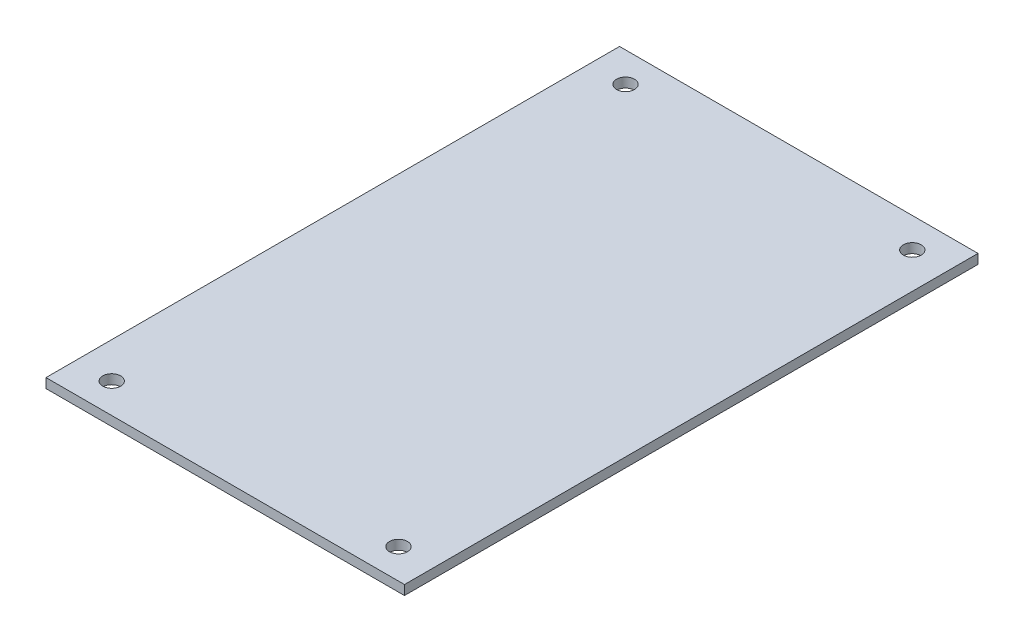
ISO-10303-21;
HEADER;
FILE_DESCRIPTION(('STEP AP214'),'2;1');
FILE_NAME('part.step','',(''),(''),'','','');
FILE_SCHEMA(('AUTOMOTIVE_DESIGN { 1 0 10303 214 1 1 1 1 }'));
ENDSEC;
DATA;
#1=APPLICATION_CONTEXT('core data for automotive mechanical design processes');
#2=APPLICATION_PROTOCOL_DEFINITION('international standard','automotive_design',2000,#1);
#3=PRODUCT_CONTEXT('',#1,'mechanical');
#4=PRODUCT('Part','Part','',(#3));
#5=PRODUCT_RELATED_PRODUCT_CATEGORY('part','',(#4));
#6=PRODUCT_DEFINITION_FORMATION('','',#4);
#7=PRODUCT_DEFINITION_CONTEXT('part definition',#1,'design');
#8=PRODUCT_DEFINITION('design','',#6,#7);
#9=PRODUCT_DEFINITION_SHAPE('','',#8);
#10=(LENGTH_UNIT() NAMED_UNIT(*) SI_UNIT(.MILLI.,.METRE.));
#11=(NAMED_UNIT(*) PLANE_ANGLE_UNIT() SI_UNIT($,.RADIAN.));
#12=(NAMED_UNIT(*) SI_UNIT($,.STERADIAN.) SOLID_ANGLE_UNIT());
#13=UNCERTAINTY_MEASURE_WITH_UNIT(LENGTH_MEASURE(1.E-05),#10,'distance_accuracy_value','');
#14=(GEOMETRIC_REPRESENTATION_CONTEXT(3) GLOBAL_UNCERTAINTY_ASSIGNED_CONTEXT((#13)) GLOBAL_UNIT_ASSIGNED_CONTEXT((#10,
#11,#12)) REPRESENTATION_CONTEXT('',''));
#15=CARTESIAN_POINT('',(0.,0.,0.));
#16=DIRECTION('',(0.,0.,1.));
#17=DIRECTION('',(1.,0.,0.));
#18=AXIS2_PLACEMENT_3D('',#15,#16,#17);
#19=CARTESIAN_POINT('',(-30.,0.,48.));
#20=DIRECTION('',(0.,1.,0.));
#21=DIRECTION('',(0.,0.,1.));
#22=AXIS2_PLACEMENT_3D('',#19,#20,#21);
#23=PLANE('',#22);
#24=DIRECTION('',(0.,0.,-1.));
#25=VECTOR('',#24,1.);
#26=CARTESIAN_POINT('',(30.,0.,-48.));
#27=LINE('',#26,#25);
#28=CARTESIAN_POINT('',(30.,0.,-48.));
#29=VERTEX_POINT('',#28);
#30=CARTESIAN_POINT('',(30.,0.,48.));
#31=VERTEX_POINT('',#30);
#32=EDGE_CURVE('E58',#29,#31,#27,.F.);
#33=ORIENTED_EDGE('',*,*,#32,.F.);
#34=DIRECTION('',(-1.,0.,0.));
#35=VECTOR('',#34,1.);
#36=CARTESIAN_POINT('',(-30.,0.,-48.));
#37=LINE('',#36,#35);
#38=CARTESIAN_POINT('',(-30.,0.,-48.));
#39=VERTEX_POINT('',#38);
#40=EDGE_CURVE('E53',#39,#29,#37,.F.);
#41=ORIENTED_EDGE('',*,*,#40,.F.);
#42=DIRECTION('',(0.,0.,1.));
#43=VECTOR('',#42,1.);
#44=CARTESIAN_POINT('',(-30.,0.,-48.));
#45=LINE('',#44,#43);
#46=CARTESIAN_POINT('',(-30.,0.,48.));
#47=VERTEX_POINT('',#46);
#48=EDGE_CURVE('E71',#47,#39,#45,.F.);
#49=ORIENTED_EDGE('',*,*,#48,.F.);
#50=DIRECTION('',(1.,0.,0.));
#51=VECTOR('',#50,1.);
#52=CARTESIAN_POINT('',(-30.,0.,48.));
#53=LINE('',#52,#51);
#54=EDGE_CURVE('E67',#31,#47,#53,.F.);
#55=ORIENTED_EDGE('',*,*,#54,.F.);
#56=EDGE_LOOP('',(#33,#41,#49,#55));
#57=FACE_BOUND('',#56,.T.);
#58=CARTESIAN_POINT('',(-24.,0.,-43.));
#59=DIRECTION('',(0.,1.,0.));
#60=DIRECTION('',(0.,0.,1.));
#61=AXIS2_PLACEMENT_3D('',#58,#59,#60);
#62=CIRCLE('',#61,1.5);
#63=CARTESIAN_POINT('',(-24.,0.,-41.5));
#64=VERTEX_POINT('',#63);
#65=EDGE_CURVE('E75',#64,#64,#62,.F.);
#66=ORIENTED_EDGE('',*,*,#65,.T.);
#67=EDGE_LOOP('',(#66));
#68=FACE_BOUND('',#67,.T.);
#69=CARTESIAN_POINT('',(-24.,0.,43.));
#70=DIRECTION('',(0.,1.,0.));
#71=DIRECTION('',(0.,0.,1.));
#72=AXIS2_PLACEMENT_3D('',#69,#70,#71);
#73=CIRCLE('',#72,1.5);
#74=CARTESIAN_POINT('',(-24.,0.,44.5));
#75=VERTEX_POINT('',#74);
#76=EDGE_CURVE('E99',#75,#75,#73,.F.);
#77=ORIENTED_EDGE('',*,*,#76,.T.);
#78=EDGE_LOOP('',(#77));
#79=FACE_BOUND('',#78,.T.);
#80=CARTESIAN_POINT('',(24.,0.,43.));
#81=DIRECTION('',(0.,1.,0.));
#82=DIRECTION('',(0.,0.,1.));
#83=AXIS2_PLACEMENT_3D('',#80,#81,#82);
#84=CIRCLE('',#83,1.50000000000001);
#85=CARTESIAN_POINT('',(24.,0.,44.5));
#86=VERTEX_POINT('',#85);
#87=EDGE_CURVE('E101',#86,#86,#84,.F.);
#88=ORIENTED_EDGE('',*,*,#87,.T.);
#89=EDGE_LOOP('',(#88));
#90=FACE_BOUND('',#89,.T.);
#91=CARTESIAN_POINT('',(24.,0.,-43.));
#92=DIRECTION('',(0.,1.,0.));
#93=DIRECTION('',(0.,0.,1.));
#94=AXIS2_PLACEMENT_3D('',#91,#92,#93);
#95=CIRCLE('',#94,1.5);
#96=CARTESIAN_POINT('',(24.,0.,-41.5));
#97=VERTEX_POINT('',#96);
#98=EDGE_CURVE('E20',#97,#97,#95,.F.);
#99=ORIENTED_EDGE('',*,*,#98,.T.);
#100=EDGE_LOOP('',(#99));
#101=FACE_BOUND('',#100,.T.);
#102=ADVANCED_FACE('F17',(#57,#68,#79,#90,#101),#23,.T.);
#103=CARTESIAN_POINT('',(24.,-1.6,-43.));
#104=DIRECTION('',(0.,1.,0.));
#105=DIRECTION('',(0.,0.,1.));
#106=AXIS2_PLACEMENT_3D('',#103,#104,#105);
#107=CYLINDRICAL_SURFACE('',#106,1.5);
#108=CARTESIAN_POINT('',(24.,-1.6,-43.));
#109=DIRECTION('',(0.,1.,0.));
#110=DIRECTION('',(0.,0.,1.));
#111=AXIS2_PLACEMENT_3D('',#108,#109,#110);
#112=CIRCLE('',#111,1.5);
#113=CARTESIAN_POINT('',(24.,-1.6,-41.5));
#114=VERTEX_POINT('',#113);
#115=EDGE_CURVE('E93',#114,#114,#112,.F.);
#116=ORIENTED_EDGE('',*,*,#115,.T.);
#117=EDGE_LOOP('',(#116));
#118=FACE_BOUND('',#117,.T.);
#119=ORIENTED_EDGE('',*,*,#98,.F.);
#120=EDGE_LOOP('',(#119));
#121=FACE_BOUND('',#120,.T.);
#122=ADVANCED_FACE('F109',(#118,#121),#107,.F.);
#123=CARTESIAN_POINT('',(24.,-1.6,43.));
#124=DIRECTION('',(0.,1.,0.));
#125=DIRECTION('',(0.,0.,1.));
#126=AXIS2_PLACEMENT_3D('',#123,#124,#125);
#127=CYLINDRICAL_SURFACE('',#126,1.50000000000001);
#128=CARTESIAN_POINT('',(24.,-1.6,43.));
#129=DIRECTION('',(0.,1.,0.));
#130=DIRECTION('',(0.,0.,1.));
#131=AXIS2_PLACEMENT_3D('',#128,#129,#130);
#132=CIRCLE('',#131,1.50000000000001);
#133=CARTESIAN_POINT('',(24.,-1.6,44.5));
#134=VERTEX_POINT('',#133);
#135=EDGE_CURVE('E90',#134,#134,#132,.F.);
#136=ORIENTED_EDGE('',*,*,#135,.T.);
#137=EDGE_LOOP('',(#136));
#138=FACE_BOUND('',#137,.T.);
#139=ORIENTED_EDGE('',*,*,#87,.F.);
#140=EDGE_LOOP('',(#139));
#141=FACE_BOUND('',#140,.T.);
#142=ADVANCED_FACE('F111',(#138,#141),#127,.F.);
#143=CARTESIAN_POINT('',(-24.,-1.6,43.));
#144=DIRECTION('',(0.,1.,0.));
#145=DIRECTION('',(0.,0.,1.));
#146=AXIS2_PLACEMENT_3D('',#143,#144,#145);
#147=CYLINDRICAL_SURFACE('',#146,1.5);
#148=CARTESIAN_POINT('',(-24.,-1.6,43.));
#149=DIRECTION('',(0.,1.,0.));
#150=DIRECTION('',(0.,0.,1.));
#151=AXIS2_PLACEMENT_3D('',#148,#149,#150);
#152=CIRCLE('',#151,1.5);
#153=CARTESIAN_POINT('',(-24.,-1.6,44.5));
#154=VERTEX_POINT('',#153);
#155=EDGE_CURVE('E87',#154,#154,#152,.F.);
#156=ORIENTED_EDGE('',*,*,#155,.T.);
#157=EDGE_LOOP('',(#156));
#158=FACE_BOUND('',#157,.T.);
#159=ORIENTED_EDGE('',*,*,#76,.F.);
#160=EDGE_LOOP('',(#159));
#161=FACE_BOUND('',#160,.T.);
#162=ADVANCED_FACE('F118',(#158,#161),#147,.F.);
#163=CARTESIAN_POINT('',(-24.,-1.6,-43.));
#164=DIRECTION('',(0.,1.,0.));
#165=DIRECTION('',(0.,0.,1.));
#166=AXIS2_PLACEMENT_3D('',#163,#164,#165);
#167=CYLINDRICAL_SURFACE('',#166,1.5);
#168=CARTESIAN_POINT('',(-24.,-1.6,-43.));
#169=DIRECTION('',(0.,1.,0.));
#170=DIRECTION('',(0.,0.,1.));
#171=AXIS2_PLACEMENT_3D('',#168,#169,#170);
#172=CIRCLE('',#171,1.5);
#173=CARTESIAN_POINT('',(-24.,-1.6,-41.5));
#174=VERTEX_POINT('',#173);
#175=EDGE_CURVE('E84',#174,#174,#172,.F.);
#176=ORIENTED_EDGE('',*,*,#175,.T.);
#177=EDGE_LOOP('',(#176));
#178=FACE_BOUND('',#177,.T.);
#179=ORIENTED_EDGE('',*,*,#65,.F.);
#180=EDGE_LOOP('',(#179));
#181=FACE_BOUND('',#180,.T.);
#182=ADVANCED_FACE('F140',(#178,#181),#167,.F.);
#183=CARTESIAN_POINT('',(-30.,-1.6,48.));
#184=DIRECTION('',(0.,0.,1.));
#185=DIRECTION('',(1.,0.,0.));
#186=AXIS2_PLACEMENT_3D('',#183,#184,#185);
#187=PLANE('',#186);
#188=DIRECTION('',(1.,0.,0.));
#189=VECTOR('',#188,1.);
#190=CARTESIAN_POINT('',(-30.,-1.6,48.));
#191=LINE('',#190,#189);
#192=CARTESIAN_POINT('',(-30.,-1.6,48.));
#193=VERTEX_POINT('',#192);
#194=CARTESIAN_POINT('',(30.,-1.6,48.));
#195=VERTEX_POINT('',#194);
#196=EDGE_CURVE('E79',#193,#195,#191,.T.);
#197=ORIENTED_EDGE('',*,*,#196,.T.);
#198=DIRECTION('',(0.,1.,0.));
#199=VECTOR('',#198,1.);
#200=CARTESIAN_POINT('',(30.,-1.6,48.));
#201=LINE('',#200,#199);
#202=EDGE_CURVE('E63',#31,#195,#201,.F.);
#203=ORIENTED_EDGE('',*,*,#202,.F.);
#204=ORIENTED_EDGE('',*,*,#54,.T.);
#205=DIRECTION('',(0.,1.,0.));
#206=VECTOR('',#205,1.);
#207=CARTESIAN_POINT('',(-30.,-1.6,48.));
#208=LINE('',#207,#206);
#209=EDGE_CURVE('E96',#193,#47,#208,.T.);
#210=ORIENTED_EDGE('',*,*,#209,.F.);
#211=EDGE_LOOP('',(#197,#203,#204,#210));
#212=FACE_BOUND('',#211,.T.);
#213=ADVANCED_FACE('F78',(#212),#187,.T.);
#214=CARTESIAN_POINT('',(30.,-1.6,-48.));
#215=DIRECTION('',(1.,0.,0.));
#216=DIRECTION('',(0.,0.,-1.));
#217=AXIS2_PLACEMENT_3D('',#214,#215,#216);
#218=PLANE('',#217);
#219=DIRECTION('',(0.,0.,1.));
#220=VECTOR('',#219,1.);
#221=CARTESIAN_POINT('',(30.,-1.6,48.));
#222=LINE('',#221,#220);
#223=CARTESIAN_POINT('',(30.,-1.6,-48.));
#224=VERTEX_POINT('',#223);
#225=EDGE_CURVE('E223',#195,#224,#222,.F.);
#226=ORIENTED_EDGE('',*,*,#225,.T.);
#227=DIRECTION('',(0.,1.,0.));
#228=VECTOR('',#227,1.);
#229=CARTESIAN_POINT('',(30.,-1.6,-48.));
#230=LINE('',#229,#228);
#231=EDGE_CURVE('E65',#29,#224,#230,.F.);
#232=ORIENTED_EDGE('',*,*,#231,.F.);
#233=ORIENTED_EDGE('',*,*,#32,.T.);
#234=ORIENTED_EDGE('',*,*,#202,.T.);
#235=EDGE_LOOP('',(#226,#232,#233,#234));
#236=FACE_BOUND('',#235,.T.);
#237=ADVANCED_FACE('F61',(#236),#218,.T.);
#238=CARTESIAN_POINT('',(-30.,-1.6,-48.));
#239=DIRECTION('',(0.,0.,-1.));
#240=DIRECTION('',(-1.,0.,0.));
#241=AXIS2_PLACEMENT_3D('',#238,#239,#240);
#242=PLANE('',#241);
#243=DIRECTION('',(1.,0.,0.));
#244=VECTOR('',#243,1.);
#245=CARTESIAN_POINT('',(-30.,-1.6,-48.));
#246=LINE('',#245,#244);
#247=CARTESIAN_POINT('',(-30.,-1.6,-48.));
#248=VERTEX_POINT('',#247);
#249=EDGE_CURVE('E26',#224,#248,#246,.F.);
#250=ORIENTED_EDGE('',*,*,#249,.T.);
#251=DIRECTION('',(0.,1.,0.));
#252=VECTOR('',#251,1.);
#253=CARTESIAN_POINT('',(-30.,-1.6,-48.));
#254=LINE('',#253,#252);
#255=EDGE_CURVE('E34',#39,#248,#254,.F.);
#256=ORIENTED_EDGE('',*,*,#255,.F.);
#257=ORIENTED_EDGE('',*,*,#40,.T.);
#258=ORIENTED_EDGE('',*,*,#231,.T.);
#259=EDGE_LOOP('',(#250,#256,#257,#258));
#260=FACE_BOUND('',#259,.T.);
#261=ADVANCED_FACE('F129',(#260),#242,.T.);
#262=CARTESIAN_POINT('',(-30.,-1.6,-48.));
#263=DIRECTION('',(-1.,0.,0.));
#264=DIRECTION('',(0.,0.,1.));
#265=AXIS2_PLACEMENT_3D('',#262,#263,#264);
#266=PLANE('',#265);
#267=DIRECTION('',(0.,0.,1.));
#268=VECTOR('',#267,1.);
#269=CARTESIAN_POINT('',(-30.,-1.6,48.));
#270=LINE('',#269,#268);
#271=EDGE_CURVE('E11',#248,#193,#270,.T.);
#272=ORIENTED_EDGE('',*,*,#271,.T.);
#273=ORIENTED_EDGE('',*,*,#209,.T.);
#274=ORIENTED_EDGE('',*,*,#48,.T.);
#275=ORIENTED_EDGE('',*,*,#255,.T.);
#276=EDGE_LOOP('',(#272,#273,#274,#275));
#277=FACE_BOUND('',#276,.T.);
#278=ADVANCED_FACE('F123',(#277),#266,.T.);
#279=CARTESIAN_POINT('',(-30.,-1.6,48.));
#280=DIRECTION('',(0.,1.,0.));
#281=DIRECTION('',(0.,0.,1.));
#282=AXIS2_PLACEMENT_3D('',#279,#280,#281);
#283=PLANE('',#282);
#284=ORIENTED_EDGE('',*,*,#249,.F.);
#285=ORIENTED_EDGE('',*,*,#225,.F.);
#286=ORIENTED_EDGE('',*,*,#196,.F.);
#287=ORIENTED_EDGE('',*,*,#271,.F.);
#288=EDGE_LOOP('',(#284,#285,#286,#287));
#289=FACE_BOUND('',#288,.T.);
#290=ORIENTED_EDGE('',*,*,#175,.F.);
#291=EDGE_LOOP('',(#290));
#292=FACE_BOUND('',#291,.T.);
#293=ORIENTED_EDGE('',*,*,#155,.F.);
#294=EDGE_LOOP('',(#293));
#295=FACE_BOUND('',#294,.T.);
#296=ORIENTED_EDGE('',*,*,#135,.F.);
#297=EDGE_LOOP('',(#296));
#298=FACE_BOUND('',#297,.T.);
#299=ORIENTED_EDGE('',*,*,#115,.F.);
#300=EDGE_LOOP('',(#299));
#301=FACE_BOUND('',#300,.T.);
#302=ADVANCED_FACE('F121',(#289,#292,#295,#298,#301),#283,.F.);
#303=CLOSED_SHELL('',(#102,#122,#142,#162,#182,#213,#237,#261,#278,#302));
#304=MANIFOLD_SOLID_BREP('B1',#303);
#305=ADVANCED_BREP_SHAPE_REPRESENTATION('',(#18,#304),#14);
#306=SHAPE_DEFINITION_REPRESENTATION(#9,#305);
ENDSEC;
END-ISO-10303-21;
